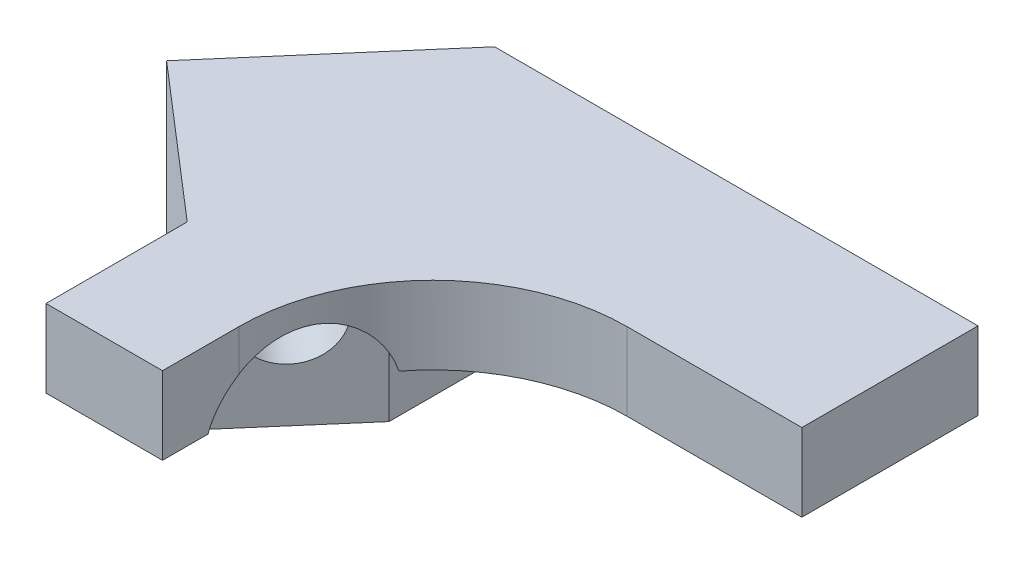
ISO-10303-21;
HEADER;
FILE_DESCRIPTION(('STEP AP214'),'2;1');
FILE_NAME('part.step','',(''),(''),'','','');
FILE_SCHEMA(('AUTOMOTIVE_DESIGN { 1 0 10303 214 1 1 1 1 }'));
ENDSEC;
DATA;
#1=APPLICATION_CONTEXT('core data for automotive mechanical design processes');
#2=APPLICATION_PROTOCOL_DEFINITION('international standard','automotive_design',2000,#1);
#3=PRODUCT_CONTEXT('',#1,'mechanical');
#4=PRODUCT('Part','Part','',(#3));
#5=PRODUCT_RELATED_PRODUCT_CATEGORY('part','',(#4));
#6=PRODUCT_DEFINITION_FORMATION('','',#4);
#7=PRODUCT_DEFINITION_CONTEXT('part definition',#1,'design');
#8=PRODUCT_DEFINITION('design','',#6,#7);
#9=PRODUCT_DEFINITION_SHAPE('','',#8);
#10=(LENGTH_UNIT() NAMED_UNIT(*) SI_UNIT(.MILLI.,.METRE.));
#11=(NAMED_UNIT(*) PLANE_ANGLE_UNIT() SI_UNIT($,.RADIAN.));
#12=(NAMED_UNIT(*) SI_UNIT($,.STERADIAN.) SOLID_ANGLE_UNIT());
#13=UNCERTAINTY_MEASURE_WITH_UNIT(LENGTH_MEASURE(1.E-05),#10,'distance_accuracy_value','');
#14=(GEOMETRIC_REPRESENTATION_CONTEXT(3) GLOBAL_UNCERTAINTY_ASSIGNED_CONTEXT((#13)) GLOBAL_UNIT_ASSIGNED_CONTEXT((#10,
#11,#12)) REPRESENTATION_CONTEXT('',''));
#15=CARTESIAN_POINT('',(0.,0.,0.));
#16=DIRECTION('',(0.,0.,1.));
#17=DIRECTION('',(1.,0.,0.));
#18=AXIS2_PLACEMENT_3D('',#15,#16,#17);
#19=CARTESIAN_POINT('',(0.,-4.,0.));
#20=DIRECTION('',(0.,-1.,0.));
#21=DIRECTION('',(0.,0.,-1.));
#22=AXIS2_PLACEMENT_3D('',#19,#20,#21);
#23=PLANE('',#22);
#24=DIRECTION('',(0.653102689208867,0.,-0.757269355875534));
#25=VECTOR('',#24,1.);
#26=CARTESIAN_POINT('',(-20.8949587437814,-4.,-13.5633470092839));
#27=LINE('',#26,#25);
#28=CARTESIAN_POINT('',(-25.7572693558755,-4.,-7.9255217696611));
#29=VERTEX_POINT('',#28);
#30=CARTESIAN_POINT('',(-25.6359281491759,-4.,-8.06621630201698));
#31=VERTEX_POINT('',#30);
#32=EDGE_CURVE('E173',#29,#31,#27,.T.);
#33=ORIENTED_EDGE('',*,*,#32,.T.);
#34=DIRECTION('',(-0.757269355875534,0.,-0.653102689208867));
#35=VECTOR('',#34,1.);
#36=CARTESIAN_POINT('',(-6.94441468649743,-4.,8.05417416822075));
#37=LINE('',#36,#35);
#38=CARTESIAN_POINT('',(-19.,-4.,-2.34309745929979));
#39=VERTEX_POINT('',#38);
#40=EDGE_CURVE('E151',#39,#31,#37,.T.);
#41=ORIENTED_EDGE('',*,*,#40,.F.);
#42=DIRECTION('',(0.,0.,-1.));
#43=VECTOR('',#42,1.);
#44=CARTESIAN_POINT('',(-19.,-4.,-13.9289598148142));
#45=LINE('',#44,#43);
#46=CARTESIAN_POINT('',(-19.,-4.,0.));
#47=VERTEX_POINT('',#46);
#48=EDGE_CURVE('E207',#47,#39,#45,.T.);
#49=ORIENTED_EDGE('',*,*,#48,.F.);
#50=DIRECTION('',(1.,0.,0.));
#51=VECTOR('',#50,1.);
#52=CARTESIAN_POINT('',(-19.,-4.,0.));
#53=LINE('',#52,#51);
#54=CARTESIAN_POINT('',(-25.,-4.,0.));
#55=VERTEX_POINT('',#54);
#56=EDGE_CURVE('E203',#55,#47,#53,.T.);
#57=ORIENTED_EDGE('',*,*,#56,.F.);
#58=DIRECTION('',(0.,0.,1.));
#59=VECTOR('',#58,1.);
#60=CARTESIAN_POINT('',(-25.,-4.,0.));
#61=LINE('',#60,#59);
#62=CARTESIAN_POINT('',(-25.,-4.,-7.27241908045225));
#63=VERTEX_POINT('',#62);
#64=EDGE_CURVE('E198',#63,#55,#61,.T.);
#65=ORIENTED_EDGE('',*,*,#64,.F.);
#66=DIRECTION('',(0.757269355875534,0.,0.653102689208867));
#67=VECTOR('',#66,1.);
#68=CARTESIAN_POINT('',(-25.,-4.,-7.27241908045225));
#69=LINE('',#68,#67);
#70=EDGE_CURVE('E195',#29,#63,#69,.T.);
#71=ORIENTED_EDGE('',*,*,#70,.F.);
#72=EDGE_LOOP('',(#33,#41,#49,#57,#65,#71));
#73=FACE_BOUND('',#72,.T.);
#74=ADVANCED_FACE('F39',(#73),#23,.T.);
#75=CARTESIAN_POINT('',(-20.9150301245878,-4.,-13.5400743419593));
#76=VERTEX_POINT('',#75);
#77=CARTESIAN_POINT('',(-18.8949587437814,-4.,-15.8823371723557));
#78=VERTEX_POINT('',#77);
#79=EDGE_CURVE('E162',#76,#78,#27,.T.);
#80=ORIENTED_EDGE('',*,*,#79,.T.);
#81=DIRECTION('',(0.,0.,-1.));
#82=VECTOR('',#81,1.);
#83=CARTESIAN_POINT('',(-18.8949587437814,-4.,-23.));
#84=LINE('',#83,#82);
#85=CARTESIAN_POINT('',(-18.8949587437814,-4.,-23.));
#86=VERTEX_POINT('',#85);
#87=EDGE_CURVE('E296',#78,#86,#84,.T.);
#88=ORIENTED_EDGE('',*,*,#87,.T.);
#89=DIRECTION('',(-1.,0.,0.));
#90=VECTOR('',#89,1.);
#91=CARTESIAN_POINT('',(-24.8949587437814,-4.,-23.));
#92=LINE('',#91,#90);
#93=CARTESIAN_POINT('',(0.,-4.,-23.));
#94=VERTEX_POINT('',#93);
#95=EDGE_CURVE('E218',#94,#86,#92,.T.);
#96=ORIENTED_EDGE('',*,*,#95,.F.);
#97=DIRECTION('',(0.,0.,-1.));
#98=VECTOR('',#97,1.);
#99=CARTESIAN_POINT('',(0.,-4.,-23.));
#100=LINE('',#99,#98);
#101=CARTESIAN_POINT('',(0.,-4.,-13.9289598148142));
#102=VERTEX_POINT('',#101);
#103=EDGE_CURVE('E214',#102,#94,#100,.T.);
#104=ORIENTED_EDGE('',*,*,#103,.F.);
#105=DIRECTION('',(1.,0.,0.));
#106=VECTOR('',#105,1.);
#107=CARTESIAN_POINT('',(0.,-4.,-13.9289598148142));
#108=LINE('',#107,#106);
#109=CARTESIAN_POINT('',(-9.,-4.,-13.9289598148142));
#110=VERTEX_POINT('',#109);
#111=EDGE_CURVE('E211',#110,#102,#108,.T.);
#112=ORIENTED_EDGE('',*,*,#111,.F.);
#113=CARTESIAN_POINT('',(-9.,-4.,-3.92895981481421));
#114=DIRECTION('',(0.,-1.,0.));
#115=DIRECTION('',(0.,0.,-1.));
#116=AXIS2_PLACEMENT_3D('',#113,#114,#115);
#117=CIRCLE('',#116,10.);
#118=CARTESIAN_POINT('',(-16.8919477769994,-4.,-10.0703896389768));
#119=VERTEX_POINT('',#118);
#120=EDGE_CURVE('E165',#110,#119,#117,.F.);
#121=ORIENTED_EDGE('',*,*,#120,.T.);
#122=DIRECTION('',(-0.757269355875534,0.,-0.653102689208867));
#123=VECTOR('',#122,1.);
#124=CARTESIAN_POINT('',(-2.22351666190938,-4.,2.58031612827848));
#125=LINE('',#124,#123);
#126=EDGE_CURVE('E148',#76,#119,#125,.F.);
#127=ORIENTED_EDGE('',*,*,#126,.F.);
#128=EDGE_LOOP('',(#80,#88,#96,#104,#112,#121,#127));
#129=FACE_BOUND('',#128,.T.);
#130=ADVANCED_FACE('F160',(#129),#23,.T.);
#131=CARTESIAN_POINT('',(-19.,-4.,-13.9289598148142));
#132=DIRECTION('',(1.,0.,0.));
#133=DIRECTION('',(0.,0.,-1.));
#134=AXIS2_PLACEMENT_3D('',#131,#132,#133);
#135=PLANE('',#134);
#136=CARTESIAN_POINT('',(-19.,-5.,-7.11578243018652));
#137=DIRECTION('',(1.,0.,0.));
#138=DIRECTION('',(0.,0.,-1.));
#139=AXIS2_PLACEMENT_3D('',#136,#137,#138);
#140=ELLIPSE('',#139,4.95200283875788,3.75);
#141=CARTESIAN_POINT('',(-19.,-2.12971000860666,-3.92895981481421));
#142=VERTEX_POINT('',#141);
#143=EDGE_CURVE('E157',#142,#39,#140,.T.);
#144=ORIENTED_EDGE('',*,*,#143,.F.);
#145=DIRECTION('',(0.,1.,0.));
#146=VECTOR('',#145,1.);
#147=CARTESIAN_POINT('',(-19.,0.,-3.92895981481421));
#148=LINE('',#147,#146);
#149=CARTESIAN_POINT('',(-19.,0.,-3.92895981481421));
#150=VERTEX_POINT('',#149);
#151=EDGE_CURVE('E276',#142,#150,#148,.T.);
#152=ORIENTED_EDGE('',*,*,#151,.T.);
#153=DIRECTION('',(0.,0.,-1.));
#154=VECTOR('',#153,1.);
#155=CARTESIAN_POINT('',(-19.,0.,-13.9289598148142));
#156=LINE('',#155,#154);
#157=CARTESIAN_POINT('',(-19.,0.,0.));
#158=VERTEX_POINT('',#157);
#159=EDGE_CURVE('E233',#158,#150,#156,.T.);
#160=ORIENTED_EDGE('',*,*,#159,.F.);
#161=DIRECTION('',(0.,1.,0.));
#162=VECTOR('',#161,1.);
#163=CARTESIAN_POINT('',(-19.,-4.,0.));
#164=LINE('',#163,#162);
#165=EDGE_CURVE('E265',#47,#158,#164,.T.);
#166=ORIENTED_EDGE('',*,*,#165,.F.);
#167=ORIENTED_EDGE('',*,*,#48,.T.);
#168=EDGE_LOOP('',(#144,#152,#160,#166,#167));
#169=FACE_BOUND('',#168,.T.);
#170=ADVANCED_FACE('F309',(#169),#135,.T.);
#171=CARTESIAN_POINT('',(-4.58503370573354,-5.,5.31632403047418));
#172=DIRECTION('',(-0.757269355875534,0.,-0.653102689208867));
#173=DIRECTION('',(-0.653102689208867,0.,0.757269355875534));
#174=AXIS2_PLACEMENT_3D('',#171,#172,#173);
#175=CYLINDRICAL_SURFACE('',#174,2.25);
#176=CARTESIAN_POINT('',(-30.2364360225422,-5.,-16.8065833671412));
#177=DIRECTION('',(-0.757269355875534,0.,-0.653102689208867));
#178=DIRECTION('',(-0.653102689208867,0.,0.757269355875534));
#179=AXIS2_PLACEMENT_3D('',#176,#177,#178);
#180=CIRCLE('',#179,2.25);
#181=CARTESIAN_POINT('',(-31.7059170732622,-5.,-15.1027273164213));
#182=VERTEX_POINT('',#181);
#183=EDGE_CURVE('E174',#182,#182,#180,.T.);
#184=ORIENTED_EDGE('',*,*,#183,.T.);
#185=EDGE_LOOP('',(#184));
#186=FACE_BOUND('',#185,.T.);
#187=CARTESIAN_POINT('',(-23.2754791368819,-5.,-10.8031453219881));
#188=DIRECTION('',(0.757269355875534,0.,0.653102689208866));
#189=DIRECTION('',(0.653102689208867,0.,-0.757269355875534));
#190=AXIS2_PLACEMENT_3D('',#187,#188,#189);
#191=CIRCLE('',#190,2.25);
#192=CARTESIAN_POINT('',(-21.8059980861619,-5.,-12.5070013727081));
#193=VERTEX_POINT('',#192);
#194=EDGE_CURVE('E254',#193,#193,#191,.T.);
#195=ORIENTED_EDGE('',*,*,#194,.T.);
#196=EDGE_LOOP('',(#195));
#197=FACE_BOUND('',#196,.T.);
#198=ADVANCED_FACE('F305',(#186,#197),#175,.F.);
#199=CARTESIAN_POINT('',(-25.,-4.,-7.27241908045225));
#200=DIRECTION('',(-0.653102689208867,0.,0.757269355875534));
#201=DIRECTION('',(0.757269355875534,0.,0.653102689208867));
#202=AXIS2_PLACEMENT_3D('',#199,#200,#201);
#203=PLANE('',#202);
#204=DIRECTION('',(0.757269355875534,0.,0.653102689208867));
#205=VECTOR('',#204,1.);
#206=CARTESIAN_POINT('',(-25.,0.,-7.27241908045225));
#207=LINE('',#206,#205);
#208=CARTESIAN_POINT('',(-32.7182262415359,0.,-13.9289598148142));
#209=VERTEX_POINT('',#208);
#210=CARTESIAN_POINT('',(-25.,0.,-7.27241908045225));
#211=VERTEX_POINT('',#210);
#212=EDGE_CURVE('E188',#209,#211,#207,.T.);
#213=ORIENTED_EDGE('',*,*,#212,.F.);
#214=DIRECTION('',(0.,1.,0.));
#215=VECTOR('',#214,1.);
#216=CARTESIAN_POINT('',(-32.7182262415359,-4.,-13.9289598148142));
#217=LINE('',#216,#215);
#218=CARTESIAN_POINT('',(-32.7182262415359,-10.,-13.9289598148142));
#219=VERTEX_POINT('',#218);
#220=EDGE_CURVE('E251',#219,#209,#217,.T.);
#221=ORIENTED_EDGE('',*,*,#220,.F.);
#222=DIRECTION('',(0.757269355875534,0.,0.653102689208867));
#223=VECTOR('',#222,1.);
#224=CARTESIAN_POINT('',(-25.7572693558755,-10.,-7.9255217696611));
#225=LINE('',#224,#223);
#226=CARTESIAN_POINT('',(-25.7572693558755,-10.,-7.9255217696611));
#227=VERTEX_POINT('',#226);
#228=EDGE_CURVE('E183',#219,#227,#225,.T.);
#229=ORIENTED_EDGE('',*,*,#228,.T.);
#230=DIRECTION('',(0.,1.,0.));
#231=VECTOR('',#230,1.);
#232=CARTESIAN_POINT('',(-25.7572693558755,-10.,-7.9255217696611));
#233=LINE('',#232,#231);
#234=EDGE_CURVE('E185',#227,#29,#233,.T.);
#235=ORIENTED_EDGE('',*,*,#234,.T.);
#236=ORIENTED_EDGE('',*,*,#70,.T.);
#237=DIRECTION('',(0.,1.,0.));
#238=VECTOR('',#237,1.);
#239=CARTESIAN_POINT('',(-25.,-4.,-7.27241908045225));
#240=LINE('',#239,#238);
#241=EDGE_CURVE('E221',#63,#211,#240,.T.);
#242=ORIENTED_EDGE('',*,*,#241,.T.);
#243=EDGE_LOOP('',(#213,#221,#229,#235,#236,#242));
#244=FACE_BOUND('',#243,.T.);
#245=ADVANCED_FACE('F308',(#244),#203,.T.);
#246=CARTESIAN_POINT('',(-32.7182262415359,-4.,-13.9289598148142));
#247=DIRECTION('',(-0.757269355875534,0.,-0.653102689208867));
#248=DIRECTION('',(-0.653102689208867,0.,0.757269355875534));
#249=AXIS2_PLACEMENT_3D('',#246,#247,#248);
#250=PLANE('',#249);
#251=ORIENTED_EDGE('',*,*,#183,.F.);
#252=EDGE_LOOP('',(#251));
#253=FACE_BOUND('',#252,.T.);
#254=DIRECTION('',(-0.653102689208867,0.,0.757269355875534));
#255=VECTOR('',#254,1.);
#256=CARTESIAN_POINT('',(-32.7182262415359,0.,-13.9289598148142));
#257=LINE('',#256,#255);
#258=CARTESIAN_POINT('',(-24.8949587437814,0.,-23.));
#259=VERTEX_POINT('',#258);
#260=EDGE_CURVE('E199',#259,#209,#257,.T.);
#261=ORIENTED_EDGE('',*,*,#260,.F.);
#262=DIRECTION('',(0.,1.,0.));
#263=VECTOR('',#262,1.);
#264=CARTESIAN_POINT('',(-24.8949587437814,-4.,-23.));
#265=LINE('',#264,#263);
#266=CARTESIAN_POINT('',(-24.8949587437814,-10.,-23.));
#267=VERTEX_POINT('',#266);
#268=EDGE_CURVE('E255',#267,#259,#265,.T.);
#269=ORIENTED_EDGE('',*,*,#268,.F.);
#270=DIRECTION('',(-0.653102689208867,0.,0.757269355875534));
#271=VECTOR('',#270,1.);
#272=CARTESIAN_POINT('',(-32.7182262415359,-10.,-13.9289598148142));
#273=LINE('',#272,#271);
#274=EDGE_CURVE('E365',#267,#219,#273,.T.);
#275=ORIENTED_EDGE('',*,*,#274,.T.);
#276=ORIENTED_EDGE('',*,*,#220,.T.);
#277=EDGE_LOOP('',(#261,#269,#275,#276));
#278=FACE_BOUND('',#277,.T.);
#279=ADVANCED_FACE('F328',(#253,#278),#250,.T.);
#280=CARTESIAN_POINT('',(-24.8949587437814,-4.,-23.));
#281=DIRECTION('',(0.,0.,-1.));
#282=DIRECTION('',(-1.,0.,0.));
#283=AXIS2_PLACEMENT_3D('',#280,#281,#282);
#284=PLANE('',#283);
#285=DIRECTION('',(-1.,0.,0.));
#286=VECTOR('',#285,1.);
#287=CARTESIAN_POINT('',(-24.8949587437814,0.,-23.));
#288=LINE('',#287,#286);
#289=CARTESIAN_POINT('',(0.,0.,-23.));
#290=VERTEX_POINT('',#289);
#291=EDGE_CURVE('E244',#290,#259,#288,.T.);
#292=ORIENTED_EDGE('',*,*,#291,.F.);
#293=DIRECTION('',(0.,1.,0.));
#294=VECTOR('',#293,1.);
#295=CARTESIAN_POINT('',(0.,-4.,-23.));
#296=LINE('',#295,#294);
#297=EDGE_CURVE('E258',#94,#290,#296,.T.);
#298=ORIENTED_EDGE('',*,*,#297,.F.);
#299=ORIENTED_EDGE('',*,*,#95,.T.);
#300=CARTESIAN_POINT('',(-18.8949587437814,-6.,-23.));
#301=DIRECTION('',(0.,0.,-1.));
#302=DIRECTION('',(-1.,0.,0.));
#303=AXIS2_PLACEMENT_3D('',#300,#301,#302);
#304=CIRCLE('',#303,2.);
#305=CARTESIAN_POINT('',(-20.8949587437814,-6.,-23.));
#306=VERTEX_POINT('',#305);
#307=EDGE_CURVE('E48',#86,#306,#304,.F.);
#308=ORIENTED_EDGE('',*,*,#307,.T.);
#309=DIRECTION('',(0.,1.,0.));
#310=VECTOR('',#309,1.);
#311=CARTESIAN_POINT('',(-20.8949587437814,-10.,-23.));
#312=LINE('',#311,#310);
#313=CARTESIAN_POINT('',(-20.8949587437814,-10.,-23.));
#314=VERTEX_POINT('',#313);
#315=EDGE_CURVE('E189',#314,#306,#312,.T.);
#316=ORIENTED_EDGE('',*,*,#315,.F.);
#317=DIRECTION('',(-1.,0.,0.));
#318=VECTOR('',#317,1.);
#319=CARTESIAN_POINT('',(-24.8949587437814,-10.,-23.));
#320=LINE('',#319,#318);
#321=EDGE_CURVE('E370',#314,#267,#320,.T.);
#322=ORIENTED_EDGE('',*,*,#321,.T.);
#323=ORIENTED_EDGE('',*,*,#268,.T.);
#324=EDGE_LOOP('',(#292,#298,#299,#308,#316,#322,#323));
#325=FACE_BOUND('',#324,.T.);
#326=ADVANCED_FACE('F331',(#325),#284,.T.);
#327=CARTESIAN_POINT('',(0.,-4.,-23.));
#328=DIRECTION('',(1.,0.,0.));
#329=DIRECTION('',(0.,0.,-1.));
#330=AXIS2_PLACEMENT_3D('',#327,#328,#329);
#331=PLANE('',#330);
#332=DIRECTION('',(0.,0.,-1.));
#333=VECTOR('',#332,1.);
#334=CARTESIAN_POINT('',(0.,0.,-23.));
#335=LINE('',#334,#333);
#336=CARTESIAN_POINT('',(0.,0.,-13.9289598148142));
#337=VERTEX_POINT('',#336);
#338=EDGE_CURVE('E240',#337,#290,#335,.T.);
#339=ORIENTED_EDGE('',*,*,#338,.F.);
#340=DIRECTION('',(0.,1.,0.));
#341=VECTOR('',#340,1.);
#342=CARTESIAN_POINT('',(0.,-4.,-13.9289598148142));
#343=LINE('',#342,#341);
#344=EDGE_CURVE('E261',#102,#337,#343,.T.);
#345=ORIENTED_EDGE('',*,*,#344,.F.);
#346=ORIENTED_EDGE('',*,*,#103,.T.);
#347=ORIENTED_EDGE('',*,*,#297,.T.);
#348=EDGE_LOOP('',(#339,#345,#346,#347));
#349=FACE_BOUND('',#348,.T.);
#350=ADVANCED_FACE('F335',(#349),#331,.T.);
#351=CARTESIAN_POINT('',(0.,-4.,-13.9289598148142));
#352=DIRECTION('',(0.,0.,1.));
#353=DIRECTION('',(1.,0.,0.));
#354=AXIS2_PLACEMENT_3D('',#351,#352,#353);
#355=PLANE('',#354);
#356=DIRECTION('',(1.,0.,0.));
#357=VECTOR('',#356,1.);
#358=CARTESIAN_POINT('',(0.,0.,-13.9289598148142));
#359=LINE('',#358,#357);
#360=CARTESIAN_POINT('',(-9.,0.,-13.9289598148142));
#361=VERTEX_POINT('',#360);
#362=EDGE_CURVE('E237',#361,#337,#359,.T.);
#363=ORIENTED_EDGE('',*,*,#362,.F.);
#364=DIRECTION('',(0.,1.,0.));
#365=VECTOR('',#364,1.);
#366=CARTESIAN_POINT('',(-9.,-4.,-13.9289598148142));
#367=LINE('',#366,#365);
#368=EDGE_CURVE('E280',#361,#110,#367,.F.);
#369=ORIENTED_EDGE('',*,*,#368,.T.);
#370=ORIENTED_EDGE('',*,*,#111,.T.);
#371=ORIENTED_EDGE('',*,*,#344,.T.);
#372=EDGE_LOOP('',(#363,#369,#370,#371));
#373=FACE_BOUND('',#372,.T.);
#374=ADVANCED_FACE('F338',(#373),#355,.T.);
#375=CARTESIAN_POINT('',(-19.,-4.,0.));
#376=DIRECTION('',(0.,0.,1.));
#377=DIRECTION('',(1.,0.,0.));
#378=AXIS2_PLACEMENT_3D('',#375,#376,#377);
#379=PLANE('',#378);
#380=DIRECTION('',(1.,0.,0.));
#381=VECTOR('',#380,1.);
#382=CARTESIAN_POINT('',(-19.,0.,0.));
#383=LINE('',#382,#381);
#384=CARTESIAN_POINT('',(-25.,0.,0.));
#385=VERTEX_POINT('',#384);
#386=EDGE_CURVE('E229',#385,#158,#383,.T.);
#387=ORIENTED_EDGE('',*,*,#386,.F.);
#388=DIRECTION('',(0.,1.,0.));
#389=VECTOR('',#388,1.);
#390=CARTESIAN_POINT('',(-25.,-4.,0.));
#391=LINE('',#390,#389);
#392=EDGE_CURVE('E268',#55,#385,#391,.T.);
#393=ORIENTED_EDGE('',*,*,#392,.F.);
#394=ORIENTED_EDGE('',*,*,#56,.T.);
#395=ORIENTED_EDGE('',*,*,#165,.T.);
#396=EDGE_LOOP('',(#387,#393,#394,#395));
#397=FACE_BOUND('',#396,.T.);
#398=ADVANCED_FACE('F342',(#397),#379,.T.);
#399=CARTESIAN_POINT('',(-25.,-4.,0.));
#400=DIRECTION('',(-1.,0.,0.));
#401=DIRECTION('',(0.,0.,1.));
#402=AXIS2_PLACEMENT_3D('',#399,#400,#401);
#403=PLANE('',#402);
#404=DIRECTION('',(0.,0.,1.));
#405=VECTOR('',#404,1.);
#406=CARTESIAN_POINT('',(-25.,0.,0.));
#407=LINE('',#406,#405);
#408=EDGE_CURVE('E225',#211,#385,#407,.T.);
#409=ORIENTED_EDGE('',*,*,#408,.F.);
#410=ORIENTED_EDGE('',*,*,#241,.F.);
#411=ORIENTED_EDGE('',*,*,#64,.T.);
#412=ORIENTED_EDGE('',*,*,#392,.T.);
#413=EDGE_LOOP('',(#409,#410,#411,#412));
#414=FACE_BOUND('',#413,.T.);
#415=ADVANCED_FACE('F326',(#414),#403,.T.);
#416=CARTESIAN_POINT('',(0.,0.,0.));
#417=DIRECTION('',(0.,-1.,0.));
#418=DIRECTION('',(0.,0.,-1.));
#419=AXIS2_PLACEMENT_3D('',#416,#417,#418);
#420=PLANE('',#419);
#421=ORIENTED_EDGE('',*,*,#212,.T.);
#422=ORIENTED_EDGE('',*,*,#408,.T.);
#423=ORIENTED_EDGE('',*,*,#386,.T.);
#424=ORIENTED_EDGE('',*,*,#159,.T.);
#425=CARTESIAN_POINT('',(-9.,0.,-3.92895981481421));
#426=DIRECTION('',(0.,-1.,0.));
#427=DIRECTION('',(0.,0.,-1.));
#428=AXIS2_PLACEMENT_3D('',#425,#426,#427);
#429=CIRCLE('',#428,10.);
#430=EDGE_CURVE('E283',#150,#361,#429,.T.);
#431=ORIENTED_EDGE('',*,*,#430,.T.);
#432=ORIENTED_EDGE('',*,*,#362,.T.);
#433=ORIENTED_EDGE('',*,*,#338,.T.);
#434=ORIENTED_EDGE('',*,*,#291,.T.);
#435=ORIENTED_EDGE('',*,*,#260,.T.);
#436=EDGE_LOOP('',(#421,#422,#423,#424,#431,#432,#433,#434,#435));
#437=FACE_BOUND('',#436,.T.);
#438=ADVANCED_FACE('F319',(#437),#420,.F.);
#439=CARTESIAN_POINT('',(-20.8949587437814,-10.,-13.5633470092839));
#440=DIRECTION('',(0.757269355875534,0.,0.653102689208866));
#441=DIRECTION('',(0.653102689208867,0.,-0.757269355875534));
#442=AXIS2_PLACEMENT_3D('',#439,#440,#441);
#443=PLANE('',#442);
#444=ORIENTED_EDGE('',*,*,#194,.F.);
#445=EDGE_LOOP('',(#444));
#446=FACE_BOUND('',#445,.T.);
#447=CARTESIAN_POINT('',(-23.2754791368819,-5.,-10.8031453219881));
#448=DIRECTION('',(0.757269355875534,0.,0.653102689208867));
#449=DIRECTION('',(0.653102689208867,0.,-0.757269355875534));
#450=AXIS2_PLACEMENT_3D('',#447,#448,#449);
#451=CIRCLE('',#450,3.75);
#452=EDGE_CURVE('E145',#76,#31,#451,.T.);
#453=ORIENTED_EDGE('',*,*,#452,.T.);
#454=ORIENTED_EDGE('',*,*,#32,.F.);
#455=ORIENTED_EDGE('',*,*,#234,.F.);
#456=DIRECTION('',(0.653102689208867,0.,-0.757269355875534));
#457=VECTOR('',#456,1.);
#458=CARTESIAN_POINT('',(-20.8949587437814,-10.,-13.5633470092839));
#459=LINE('',#458,#457);
#460=CARTESIAN_POINT('',(-20.8949587437814,-10.,-13.5633470092839));
#461=VERTEX_POINT('',#460);
#462=EDGE_CURVE('E178',#227,#461,#459,.T.);
#463=ORIENTED_EDGE('',*,*,#462,.T.);
#464=DIRECTION('',(0.,1.,0.));
#465=VECTOR('',#464,1.);
#466=CARTESIAN_POINT('',(-20.8949587437814,-10.,-13.5633470092839));
#467=LINE('',#466,#465);
#468=CARTESIAN_POINT('',(-20.8949587437814,-6.,-13.5633470092839));
#469=VERTEX_POINT('',#468);
#470=EDGE_CURVE('E192',#461,#469,#467,.T.);
#471=ORIENTED_EDGE('',*,*,#470,.T.);
#472=CARTESIAN_POINT('',(-18.8949587437814,-6.,-15.8823371723557));
#473=DIRECTION('',(0.757269355875534,0.,0.653102689208866));
#474=DIRECTION('',(-0.653102689208867,0.,0.757269355875534));
#475=AXIS2_PLACEMENT_3D('',#472,#473,#474);
#476=ELLIPSE('',#475,3.06230556548878,2.);
#477=EDGE_CURVE('E11',#469,#78,#476,.F.);
#478=ORIENTED_EDGE('',*,*,#477,.T.);
#479=ORIENTED_EDGE('',*,*,#79,.F.);
#480=EDGE_LOOP('',(#453,#454,#455,#463,#471,#478,#479));
#481=FACE_BOUND('',#480,.T.);
#482=ADVANCED_FACE('F169',(#446,#481),#443,.T.);
#483=CARTESIAN_POINT('',(-20.8949587437814,-10.,-13.5633470092839));
#484=DIRECTION('',(1.,0.,0.));
#485=DIRECTION('',(0.,0.,-1.));
#486=AXIS2_PLACEMENT_3D('',#483,#484,#485);
#487=PLANE('',#486);
#488=ORIENTED_EDGE('',*,*,#315,.T.);
#489=DIRECTION('',(0.,0.,-1.));
#490=VECTOR('',#489,1.);
#491=CARTESIAN_POINT('',(-20.8949587437814,-6.,-13.5633470092839));
#492=LINE('',#491,#490);
#493=EDGE_CURVE('E61',#306,#469,#492,.F.);
#494=ORIENTED_EDGE('',*,*,#493,.T.);
#495=ORIENTED_EDGE('',*,*,#470,.F.);
#496=DIRECTION('',(0.,0.,-1.));
#497=VECTOR('',#496,1.);
#498=CARTESIAN_POINT('',(-20.8949587437814,-10.,-13.5633470092839));
#499=LINE('',#498,#497);
#500=EDGE_CURVE('E377',#461,#314,#499,.T.);
#501=ORIENTED_EDGE('',*,*,#500,.T.);
#502=EDGE_LOOP('',(#488,#494,#495,#501));
#503=FACE_BOUND('',#502,.T.);
#504=ADVANCED_FACE('F313',(#503),#487,.T.);
#505=CARTESIAN_POINT('',(0.,-10.,0.));
#506=DIRECTION('',(0.,-1.,0.));
#507=DIRECTION('',(0.,0.,-1.));
#508=AXIS2_PLACEMENT_3D('',#505,#506,#507);
#509=PLANE('',#508);
#510=ORIENTED_EDGE('',*,*,#462,.F.);
#511=ORIENTED_EDGE('',*,*,#228,.F.);
#512=ORIENTED_EDGE('',*,*,#274,.F.);
#513=ORIENTED_EDGE('',*,*,#321,.F.);
#514=ORIENTED_EDGE('',*,*,#500,.F.);
#515=EDGE_LOOP('',(#510,#511,#512,#513,#514));
#516=FACE_BOUND('',#515,.T.);
#517=ADVANCED_FACE('F304',(#516),#509,.T.);
#518=CARTESIAN_POINT('',(-4.58396567420341,-5.,5.31724514824962));
#519=DIRECTION('',(-0.757269355875534,0.,-0.653102689208867));
#520=DIRECTION('',(-0.653102689208867,0.,0.757269355875534));
#521=AXIS2_PLACEMENT_3D('',#518,#519,#520);
#522=CYLINDRICAL_SURFACE('',#521,3.75);
#523=ORIENTED_EDGE('',*,*,#40,.T.);
#524=ORIENTED_EDGE('',*,*,#452,.F.);
#525=ORIENTED_EDGE('',*,*,#126,.T.);
#526=CARTESIAN_POINT('',(-16.8919477769994,-4.,-10.0703896389768));
#527=CARTESIAN_POINT('',(-16.909001294239,-3.89968520303542,-10.0484608941046));
#528=CARTESIAN_POINT('',(-16.9285611931879,-3.8005356328197,-10.0231514200474));
#529=CARTESIAN_POINT('',(-16.9723152172516,-3.60524643955854,-9.96580812403369));
#530=CARTESIAN_POINT('',(-16.9965094634614,-3.50910689524113,-9.933774126364));
#531=CARTESIAN_POINT('',(-17.0491568355261,-3.32050779671556,-9.86301450401798));
#532=CARTESIAN_POINT('',(-17.0776106276843,-3.22804882111317,-9.82428783228755));
#533=CARTESIAN_POINT('',(-17.1383041115242,-3.04748789230728,-9.74021580693126));
#534=CARTESIAN_POINT('',(-17.1705436811819,-2.95938579880191,-9.69487066662176));
#535=CARTESIAN_POINT('',(-17.2383127692975,-2.78809473570064,-9.59762066403007));
#536=CARTESIAN_POINT('',(-17.2738451422469,-2.70491013327722,-9.54571009576744));
#537=CARTESIAN_POINT('',(-17.3476057578874,-2.54411175914803,-9.43549007401412));
#538=CARTESIAN_POINT('',(-17.3858349886019,-2.4665000503661,-9.37717827096458));
#539=CARTESIAN_POINT('',(-17.4643081234407,-2.31752190459325,-9.25444439491514));
#540=CARTESIAN_POINT('',(-17.5045498848474,-2.24614903871994,-9.19002875784261));
#541=CARTESIAN_POINT('',(-17.5864413047574,-2.1100405417905,-9.05528805092691));
#542=CARTESIAN_POINT('',(-17.6280914627385,-2.0453072989614,-8.98496087117691));
#543=CARTESIAN_POINT('',(-17.7114235889069,-1.92394751355694,-8.8399653158148));
#544=CARTESIAN_POINT('',(-17.7530939320061,-1.86720585596454,-8.76538658040284));
#545=CARTESIAN_POINT('',(-17.8365039434691,-1.76092000389063,-8.61125389709715));
#546=CARTESIAN_POINT('',(-17.8782436314695,-1.71137842263968,-8.53169815773663));
#547=CARTESIAN_POINT('',(-17.9611451972239,-1.61978046652157,-8.36813533158047));
#548=CARTESIAN_POINT('',(-18.0023072154602,-1.57772224168365,-8.28412935161755));
#549=CARTESIAN_POINT('',(-18.0834969105066,-1.50121430134595,-8.11215599516212));
#550=CARTESIAN_POINT('',(-18.1235241602617,-1.46676741799103,-8.0241871587174));
#551=CARTESIAN_POINT('',(-18.2016355434094,-1.40576299779777,-7.84550645598438));
#552=CARTESIAN_POINT('',(-18.239731083191,-1.37915317230696,-7.75481743426128));
#553=CARTESIAN_POINT('',(-18.3138320581709,-1.33345312305439,-7.57071860081455));
#554=CARTESIAN_POINT('',(-18.3498367429295,-1.31436558510669,-7.47730783005826));
#555=CARTESIAN_POINT('',(-18.4541002758815,-1.2682408013486,-7.19397327009968));
#556=CARTESIAN_POINT('',(-18.5186831360666,-1.25228468968428,-7.00077796319861));
#557=CARTESIAN_POINT('',(-18.6394939388413,-1.24804257792241,-6.59860665344208));
#558=CARTESIAN_POINT('',(-18.6949581391097,-1.261528893277,-6.38939363540867));
#559=CARTESIAN_POINT('',(-18.7915694669714,-1.31683949006012,-5.97132978352945));
#560=CARTESIAN_POINT('',(-18.8327034630483,-1.35868965990018,-5.76247945546354));
#561=CARTESIAN_POINT('',(-18.9057133521084,-1.47552418859391,-5.31969181956606));
#562=CARTESIAN_POINT('',(-18.9354273607841,-1.55438774540508,-5.086432627353));
#563=CARTESIAN_POINT('',(-18.9779745786695,-1.74143065985615,-4.63063285002234));
#564=CARTESIAN_POINT('',(-18.9908243423165,-1.84958114256227,-4.40808196042128));
#565=CARTESIAN_POINT('',(-18.9976919673353,-1.99637167552793,-4.14844902651483));
#566=CARTESIAN_POINT('',(-18.9985648573405,-2.0222489463113,-4.10403466266393));
#567=CARTESIAN_POINT('',(-18.999718128094,-2.0751288813534,-4.01594919211283));
#568=CARTESIAN_POINT('',(-18.9999992527128,-2.10213008916611,-3.97227722081707));
#569=CARTESIAN_POINT('',(-19.,-2.12971000860664,-3.9289598148142));
#570=B_SPLINE_CURVE_WITH_KNOTS('',3,(#526,#527,#528,#529,#530,#531,#532,#533,#534,#535,#536,
#537,#538,#539,#540,#541,#542,#543,#544,#545,#546,#547,#548,#549,#550,#551,#552,#553,#554,#555,
#556,#557,#558,#559,#560,#561,#562,#563,#564,#565,#566,#567,#568,#569),.UNSPECIFIED.,.F.,.F.,(4,
2,2,2,2,2,2,2,2,2,2,2,2,2,2,2,2,2,2,2,2,4),(0.,0.312179957721202,0.624368073783236,
0.936605075276053,1.24883201544497,1.56133219952871,1.87394747206617,2.18623671289053,
2.49863789098014,2.80593782137809,3.11334900764862,3.42068409247131,3.72813334339095,
4.03348224659508,4.33894007530412,4.94928208274431,5.59737127641379,6.24605279561088,
6.98739781890633,7.72801457053283,7.88223650237436,8.03626445559475),.UNSPECIFIED.);
#571=EDGE_CURVE('E288',#119,#142,#570,.T.);
#572=ORIENTED_EDGE('',*,*,#571,.T.);
#573=ORIENTED_EDGE('',*,*,#143,.T.);
#574=EDGE_LOOP('',(#523,#524,#525,#572,#573));
#575=FACE_BOUND('',#574,.T.);
#576=ADVANCED_FACE('F147',(#575),#522,.F.);
#577=CARTESIAN_POINT('',(-9.,-4.,-3.92895981481421));
#578=DIRECTION('',(0.,-1.,0.));
#579=DIRECTION('',(0.,0.,-1.));
#580=AXIS2_PLACEMENT_3D('',#577,#578,#579);
#581=CYLINDRICAL_SURFACE('',#580,10.);
#582=ORIENTED_EDGE('',*,*,#120,.F.);
#583=ORIENTED_EDGE('',*,*,#368,.F.);
#584=ORIENTED_EDGE('',*,*,#430,.F.);
#585=ORIENTED_EDGE('',*,*,#151,.F.);
#586=ORIENTED_EDGE('',*,*,#571,.F.);
#587=EDGE_LOOP('',(#582,#583,#584,#585,#586));
#588=FACE_BOUND('',#587,.T.);
#589=ADVANCED_FACE('F298',(#588),#581,.F.);
#590=CARTESIAN_POINT('',(-18.8949587437814,-6.,0.));
#591=DIRECTION('',(0.,0.,1.));
#592=DIRECTION('',(1.,0.,0.));
#593=AXIS2_PLACEMENT_3D('',#590,#591,#592);
#594=CYLINDRICAL_SURFACE('',#593,2.);
#595=ORIENTED_EDGE('',*,*,#477,.F.);
#596=ORIENTED_EDGE('',*,*,#493,.F.);
#597=ORIENTED_EDGE('',*,*,#307,.F.);
#598=ORIENTED_EDGE('',*,*,#87,.F.);
#599=EDGE_LOOP('',(#595,#596,#597,#598));
#600=FACE_BOUND('',#599,.T.);
#601=ADVANCED_FACE('F41',(#600),#594,.F.);
#602=CLOSED_SHELL('',(#74,#130,#170,#198,#245,#279,#326,#350,#374,#398,#415,#438,#482,#504,#517,
#576,#589,#601));
#603=MANIFOLD_SOLID_BREP('B2',#602);
#604=ADVANCED_BREP_SHAPE_REPRESENTATION('',(#18,#603),#14);
#605=SHAPE_DEFINITION_REPRESENTATION(#9,#604);
ENDSEC;
END-ISO-10303-21;
